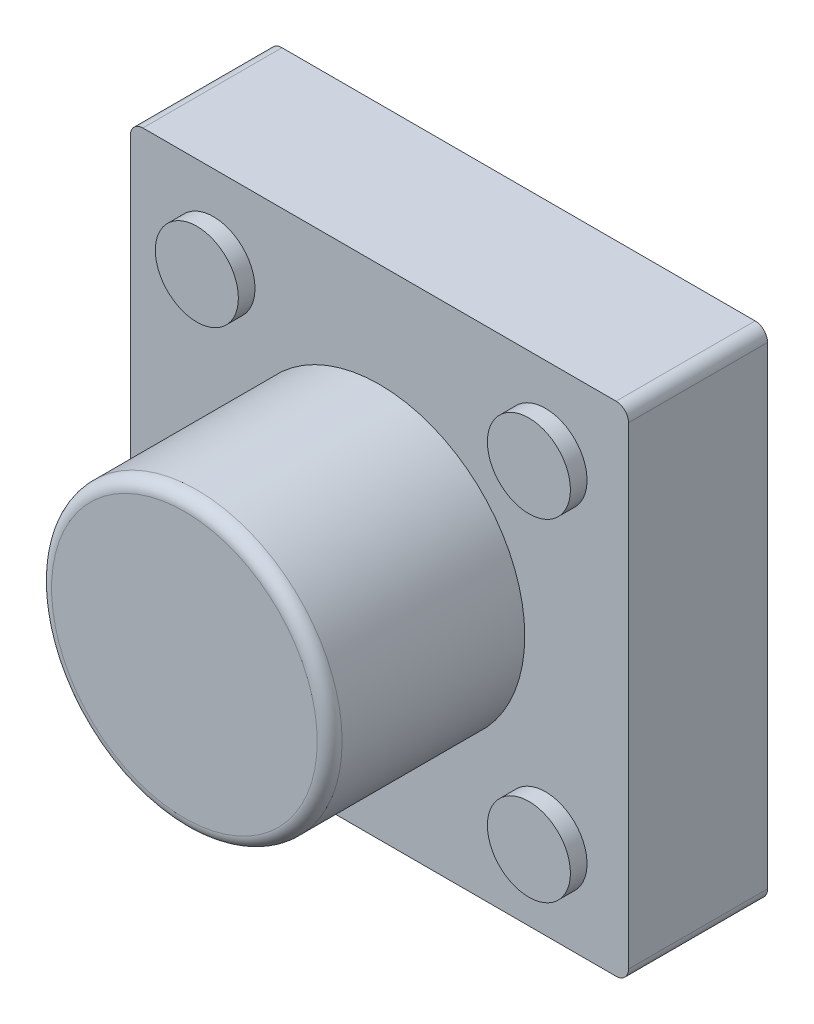
ISO-10303-21;
HEADER;
FILE_DESCRIPTION(('STEP AP214'),'2;1');
FILE_NAME('part.step','',(''),(''),'','','');
FILE_SCHEMA(('AUTOMOTIVE_DESIGN { 1 0 10303 214 1 1 1 1 }'));
ENDSEC;
DATA;
#1=APPLICATION_CONTEXT('core data for automotive mechanical design processes');
#2=APPLICATION_PROTOCOL_DEFINITION('international standard','automotive_design',2000,#1);
#3=PRODUCT_CONTEXT('',#1,'mechanical');
#4=PRODUCT('Part','Part','',(#3));
#5=PRODUCT_RELATED_PRODUCT_CATEGORY('part','',(#4));
#6=PRODUCT_DEFINITION_FORMATION('','',#4);
#7=PRODUCT_DEFINITION_CONTEXT('part definition',#1,'design');
#8=PRODUCT_DEFINITION('design','',#6,#7);
#9=PRODUCT_DEFINITION_SHAPE('','',#8);
#10=(LENGTH_UNIT() NAMED_UNIT(*) SI_UNIT(.MILLI.,.METRE.));
#11=(NAMED_UNIT(*) PLANE_ANGLE_UNIT() SI_UNIT($,.RADIAN.));
#12=(NAMED_UNIT(*) SI_UNIT($,.STERADIAN.) SOLID_ANGLE_UNIT());
#13=UNCERTAINTY_MEASURE_WITH_UNIT(LENGTH_MEASURE(1.E-05),#10,'distance_accuracy_value','');
#14=(GEOMETRIC_REPRESENTATION_CONTEXT(3) GLOBAL_UNCERTAINTY_ASSIGNED_CONTEXT((#13)) GLOBAL_UNIT_ASSIGNED_CONTEXT((#10,
#11,#12)) REPRESENTATION_CONTEXT('',''));
#15=CARTESIAN_POINT('',(0.,0.,0.));
#16=DIRECTION('',(0.,0.,1.));
#17=DIRECTION('',(1.,0.,0.));
#18=AXIS2_PLACEMENT_3D('',#15,#16,#17);
#19=CARTESIAN_POINT('',(0.,0.,3.35));
#20=DIRECTION('',(0.,0.,-1.));
#21=DIRECTION('',(-1.,0.,0.));
#22=AXIS2_PLACEMENT_3D('',#19,#20,#21);
#23=PLANE('',#22);
#24=DIRECTION('',(0.,-1.,0.));
#25=VECTOR('',#24,1.);
#26=CARTESIAN_POINT('',(0.,0.,3.35));
#27=LINE('',#26,#25);
#28=CARTESIAN_POINT('',(0.,11.7,3.35));
#29=VERTEX_POINT('',#28);
#30=CARTESIAN_POINT('',(0.,0.3,3.35));
#31=VERTEX_POINT('',#30);
#32=EDGE_CURVE('E139',#29,#31,#27,.T.);
#33=ORIENTED_EDGE('',*,*,#32,.T.);
#34=CARTESIAN_POINT('',(0.3,0.3,3.35));
#35=DIRECTION('',(0.,0.,-1.));
#36=DIRECTION('',(-1.,0.,0.));
#37=AXIS2_PLACEMENT_3D('',#34,#35,#36);
#38=CIRCLE('',#37,0.3);
#39=CARTESIAN_POINT('',(0.3,0.,3.35));
#40=VERTEX_POINT('',#39);
#41=EDGE_CURVE('E163',#31,#40,#38,.F.);
#42=ORIENTED_EDGE('',*,*,#41,.T.);
#43=DIRECTION('',(1.,0.,0.));
#44=VECTOR('',#43,1.);
#45=CARTESIAN_POINT('',(0.,0.,3.35));
#46=LINE('',#45,#44);
#47=CARTESIAN_POINT('',(11.7,0.,3.35));
#48=VERTEX_POINT('',#47);
#49=EDGE_CURVE('E122',#40,#48,#46,.T.);
#50=ORIENTED_EDGE('',*,*,#49,.T.);
#51=CARTESIAN_POINT('',(11.7,0.3,3.35));
#52=DIRECTION('',(0.,0.,-1.));
#53=DIRECTION('',(-1.,0.,0.));
#54=AXIS2_PLACEMENT_3D('',#51,#52,#53);
#55=CIRCLE('',#54,0.3);
#56=CARTESIAN_POINT('',(12.,0.3,3.35));
#57=VERTEX_POINT('',#56);
#58=EDGE_CURVE('E158',#48,#57,#55,.F.);
#59=ORIENTED_EDGE('',*,*,#58,.T.);
#60=DIRECTION('',(0.,1.,0.));
#61=VECTOR('',#60,1.);
#62=CARTESIAN_POINT('',(12.,0.,3.35));
#63=LINE('',#62,#61);
#64=CARTESIAN_POINT('',(12.,11.7,3.35));
#65=VERTEX_POINT('',#64);
#66=EDGE_CURVE('E271',#57,#65,#63,.T.);
#67=ORIENTED_EDGE('',*,*,#66,.T.);
#68=CARTESIAN_POINT('',(11.7,11.7,3.35));
#69=DIRECTION('',(0.,0.,-1.));
#70=DIRECTION('',(-1.,0.,0.));
#71=AXIS2_PLACEMENT_3D('',#68,#69,#70);
#72=CIRCLE('',#71,0.3);
#73=CARTESIAN_POINT('',(11.7,12.,3.35));
#74=VERTEX_POINT('',#73);
#75=EDGE_CURVE('E57',#65,#74,#72,.F.);
#76=ORIENTED_EDGE('',*,*,#75,.T.);
#77=DIRECTION('',(-1.,0.,0.));
#78=VECTOR('',#77,1.);
#79=CARTESIAN_POINT('',(0.,12.,3.35));
#80=LINE('',#79,#78);
#81=CARTESIAN_POINT('',(0.3,12.,3.35));
#82=VERTEX_POINT('',#81);
#83=EDGE_CURVE('E144',#74,#82,#80,.T.);
#84=ORIENTED_EDGE('',*,*,#83,.T.);
#85=CARTESIAN_POINT('',(0.3,11.7,3.35));
#86=DIRECTION('',(0.,0.,-1.));
#87=DIRECTION('',(-1.,0.,0.));
#88=AXIS2_PLACEMENT_3D('',#85,#86,#87);
#89=CIRCLE('',#88,0.3);
#90=EDGE_CURVE('E161',#82,#29,#89,.F.);
#91=ORIENTED_EDGE('',*,*,#90,.T.);
#92=EDGE_LOOP('',(#33,#42,#50,#59,#67,#76,#84,#91));
#93=FACE_BOUND('',#92,.T.);
#94=CARTESIAN_POINT('',(6.,6.,3.35));
#95=DIRECTION('',(0.,0.,-1.));
#96=DIRECTION('',(-1.,0.,0.));
#97=AXIS2_PLACEMENT_3D('',#94,#95,#96);
#98=CIRCLE('',#97,3.5);
#99=CARTESIAN_POINT('',(2.5,6.,3.35));
#100=VERTEX_POINT('',#99);
#101=EDGE_CURVE('E140',#100,#100,#98,.F.);
#102=ORIENTED_EDGE('',*,*,#101,.F.);
#103=EDGE_LOOP('',(#102));
#104=FACE_BOUND('',#103,.T.);
#105=CARTESIAN_POINT('',(2.,10.,3.35));
#106=DIRECTION('',(0.,0.,-1.));
#107=DIRECTION('',(-1.,0.,0.));
#108=AXIS2_PLACEMENT_3D('',#105,#106,#107);
#109=CIRCLE('',#108,1.);
#110=CARTESIAN_POINT('',(0.999999999999999,10.,3.35));
#111=VERTEX_POINT('',#110);
#112=EDGE_CURVE('E174',#111,#111,#109,.F.);
#113=ORIENTED_EDGE('',*,*,#112,.F.);
#114=EDGE_LOOP('',(#113));
#115=FACE_BOUND('',#114,.T.);
#116=CARTESIAN_POINT('',(10.,10.,3.35));
#117=DIRECTION('',(0.,0.,-1.));
#118=DIRECTION('',(-1.,0.,0.));
#119=AXIS2_PLACEMENT_3D('',#116,#117,#118);
#120=CIRCLE('',#119,1.);
#121=CARTESIAN_POINT('',(9.,10.,3.35));
#122=VERTEX_POINT('',#121);
#123=EDGE_CURVE('E177',#122,#122,#120,.F.);
#124=ORIENTED_EDGE('',*,*,#123,.F.);
#125=EDGE_LOOP('',(#124));
#126=FACE_BOUND('',#125,.T.);
#127=CARTESIAN_POINT('',(10.,2.,3.35));
#128=DIRECTION('',(0.,0.,-1.));
#129=DIRECTION('',(-1.,0.,0.));
#130=AXIS2_PLACEMENT_3D('',#127,#128,#129);
#131=CIRCLE('',#130,1.);
#132=CARTESIAN_POINT('',(9.,2.,3.35));
#133=VERTEX_POINT('',#132);
#134=EDGE_CURVE('E43',#133,#133,#131,.F.);
#135=ORIENTED_EDGE('',*,*,#134,.F.);
#136=EDGE_LOOP('',(#135));
#137=FACE_BOUND('',#136,.T.);
#138=CARTESIAN_POINT('',(2.,2.,3.35));
#139=DIRECTION('',(0.,0.,-1.));
#140=DIRECTION('',(-1.,0.,0.));
#141=AXIS2_PLACEMENT_3D('',#138,#139,#140);
#142=CIRCLE('',#141,1.);
#143=CARTESIAN_POINT('',(1.,2.,3.35));
#144=VERTEX_POINT('',#143);
#145=EDGE_CURVE('E11',#144,#144,#142,.F.);
#146=ORIENTED_EDGE('',*,*,#145,.F.);
#147=EDGE_LOOP('',(#146));
#148=FACE_BOUND('',#147,.T.);
#149=ADVANCED_FACE('F35',(#93,#104,#115,#126,#137,#148),#23,.F.);
#150=CARTESIAN_POINT('',(0.,0.,3.35));
#151=DIRECTION('',(1.,0.,0.));
#152=DIRECTION('',(0.,0.,-1.));
#153=AXIS2_PLACEMENT_3D('',#150,#151,#152);
#154=PLANE('',#153);
#155=DIRECTION('',(0.,-1.,0.));
#156=VECTOR('',#155,1.);
#157=CARTESIAN_POINT('',(0.,0.,0.));
#158=LINE('',#157,#156);
#159=CARTESIAN_POINT('',(0.,11.7,0.));
#160=VERTEX_POINT('',#159);
#161=CARTESIAN_POINT('',(0.,0.3,0.));
#162=VERTEX_POINT('',#161);
#163=EDGE_CURVE('E129',#160,#162,#158,.T.);
#164=ORIENTED_EDGE('',*,*,#163,.T.);
#165=DIRECTION('',(0.,0.,-1.));
#166=VECTOR('',#165,1.);
#167=CARTESIAN_POINT('',(0.,0.3,3.35));
#168=LINE('',#167,#166);
#169=EDGE_CURVE('E107',#162,#31,#168,.F.);
#170=ORIENTED_EDGE('',*,*,#169,.T.);
#171=ORIENTED_EDGE('',*,*,#32,.F.);
#172=DIRECTION('',(0.,0.,-1.));
#173=VECTOR('',#172,1.);
#174=CARTESIAN_POINT('',(0.,11.7,3.35));
#175=LINE('',#174,#173);
#176=EDGE_CURVE('E112',#29,#160,#175,.T.);
#177=ORIENTED_EDGE('',*,*,#176,.T.);
#178=EDGE_LOOP('',(#164,#170,#171,#177));
#179=FACE_BOUND('',#178,.T.);
#180=ADVANCED_FACE('F186',(#179),#154,.F.);
#181=CARTESIAN_POINT('',(0.,0.,3.35));
#182=DIRECTION('',(0.,1.,0.));
#183=DIRECTION('',(0.,0.,1.));
#184=AXIS2_PLACEMENT_3D('',#181,#182,#183);
#185=PLANE('',#184);
#186=ORIENTED_EDGE('',*,*,#49,.F.);
#187=DIRECTION('',(0.,0.,-1.));
#188=VECTOR('',#187,1.);
#189=CARTESIAN_POINT('',(0.3,0.,3.35));
#190=LINE('',#189,#188);
#191=CARTESIAN_POINT('',(0.3,0.,0.));
#192=VERTEX_POINT('',#191);
#193=EDGE_CURVE('E106',#40,#192,#190,.T.);
#194=ORIENTED_EDGE('',*,*,#193,.T.);
#195=DIRECTION('',(1.,0.,0.));
#196=VECTOR('',#195,1.);
#197=CARTESIAN_POINT('',(0.,0.,0.));
#198=LINE('',#197,#196);
#199=CARTESIAN_POINT('',(11.7,0.,0.));
#200=VERTEX_POINT('',#199);
#201=EDGE_CURVE('E119',#192,#200,#198,.T.);
#202=ORIENTED_EDGE('',*,*,#201,.T.);
#203=DIRECTION('',(0.,0.,-1.));
#204=VECTOR('',#203,1.);
#205=CARTESIAN_POINT('',(11.7,0.,3.35));
#206=LINE('',#205,#204);
#207=EDGE_CURVE('E124',#200,#48,#206,.F.);
#208=ORIENTED_EDGE('',*,*,#207,.T.);
#209=EDGE_LOOP('',(#186,#194,#202,#208));
#210=FACE_BOUND('',#209,.T.);
#211=ADVANCED_FACE('F118',(#210),#185,.F.);
#212=CARTESIAN_POINT('',(12.,0.,3.35));
#213=DIRECTION('',(-1.,0.,0.));
#214=DIRECTION('',(0.,0.,1.));
#215=AXIS2_PLACEMENT_3D('',#212,#213,#214);
#216=PLANE('',#215);
#217=DIRECTION('',(0.,1.,0.));
#218=VECTOR('',#217,1.);
#219=CARTESIAN_POINT('',(12.,0.,0.));
#220=LINE('',#219,#218);
#221=CARTESIAN_POINT('',(12.,0.3,0.));
#222=VERTEX_POINT('',#221);
#223=CARTESIAN_POINT('',(12.,11.7,0.));
#224=VERTEX_POINT('',#223);
#225=EDGE_CURVE('E128',#222,#224,#220,.T.);
#226=ORIENTED_EDGE('',*,*,#225,.T.);
#227=DIRECTION('',(0.,0.,-1.));
#228=VECTOR('',#227,1.);
#229=CARTESIAN_POINT('',(12.,11.7,3.35));
#230=LINE('',#229,#228);
#231=EDGE_CURVE('E172',#224,#65,#230,.F.);
#232=ORIENTED_EDGE('',*,*,#231,.T.);
#233=ORIENTED_EDGE('',*,*,#66,.F.);
#234=DIRECTION('',(0.,0.,-1.));
#235=VECTOR('',#234,1.);
#236=CARTESIAN_POINT('',(12.,0.3,3.35));
#237=LINE('',#236,#235);
#238=EDGE_CURVE('E169',#57,#222,#237,.T.);
#239=ORIENTED_EDGE('',*,*,#238,.T.);
#240=EDGE_LOOP('',(#226,#232,#233,#239));
#241=FACE_BOUND('',#240,.T.);
#242=ADVANCED_FACE('F239',(#241),#216,.F.);
#243=CARTESIAN_POINT('',(0.,12.,3.35));
#244=DIRECTION('',(0.,-1.,0.));
#245=DIRECTION('',(0.,0.,-1.));
#246=AXIS2_PLACEMENT_3D('',#243,#244,#245);
#247=PLANE('',#246);
#248=DIRECTION('',(-1.,0.,0.));
#249=VECTOR('',#248,1.);
#250=CARTESIAN_POINT('',(0.,12.,0.));
#251=LINE('',#250,#249);
#252=CARTESIAN_POINT('',(11.7,12.,0.));
#253=VERTEX_POINT('',#252);
#254=CARTESIAN_POINT('',(0.3,12.,0.));
#255=VERTEX_POINT('',#254);
#256=EDGE_CURVE('E132',#253,#255,#251,.T.);
#257=ORIENTED_EDGE('',*,*,#256,.T.);
#258=DIRECTION('',(0.,0.,-1.));
#259=VECTOR('',#258,1.);
#260=CARTESIAN_POINT('',(0.3,12.,3.35));
#261=LINE('',#260,#259);
#262=EDGE_CURVE('E50',#255,#82,#261,.F.);
#263=ORIENTED_EDGE('',*,*,#262,.T.);
#264=ORIENTED_EDGE('',*,*,#83,.F.);
#265=DIRECTION('',(0.,0.,-1.));
#266=VECTOR('',#265,1.);
#267=CARTESIAN_POINT('',(11.7,12.,3.35));
#268=LINE('',#267,#266);
#269=EDGE_CURVE('E165',#74,#253,#268,.T.);
#270=ORIENTED_EDGE('',*,*,#269,.T.);
#271=EDGE_LOOP('',(#257,#263,#264,#270));
#272=FACE_BOUND('',#271,.T.);
#273=ADVANCED_FACE('F236',(#272),#247,.F.);
#274=CARTESIAN_POINT('',(0.,0.,0.));
#275=DIRECTION('',(0.,0.,-1.));
#276=DIRECTION('',(-1.,0.,0.));
#277=AXIS2_PLACEMENT_3D('',#274,#275,#276);
#278=PLANE('',#277);
#279=ORIENTED_EDGE('',*,*,#201,.F.);
#280=CARTESIAN_POINT('',(0.3,0.3,0.));
#281=DIRECTION('',(0.,0.,-1.));
#282=DIRECTION('',(-1.,0.,0.));
#283=AXIS2_PLACEMENT_3D('',#280,#281,#282);
#284=CIRCLE('',#283,0.3);
#285=EDGE_CURVE('E102',#192,#162,#284,.T.);
#286=ORIENTED_EDGE('',*,*,#285,.T.);
#287=ORIENTED_EDGE('',*,*,#163,.F.);
#288=CARTESIAN_POINT('',(0.3,11.7,0.));
#289=DIRECTION('',(0.,0.,-1.));
#290=DIRECTION('',(-1.,0.,0.));
#291=AXIS2_PLACEMENT_3D('',#288,#289,#290);
#292=CIRCLE('',#291,0.3);
#293=EDGE_CURVE('E113',#160,#255,#292,.T.);
#294=ORIENTED_EDGE('',*,*,#293,.T.);
#295=ORIENTED_EDGE('',*,*,#256,.F.);
#296=CARTESIAN_POINT('',(11.7,11.7,0.));
#297=DIRECTION('',(0.,0.,-1.));
#298=DIRECTION('',(-1.,0.,0.));
#299=AXIS2_PLACEMENT_3D('',#296,#297,#298);
#300=CIRCLE('',#299,0.3);
#301=EDGE_CURVE('E152',#253,#224,#300,.T.);
#302=ORIENTED_EDGE('',*,*,#301,.T.);
#303=ORIENTED_EDGE('',*,*,#225,.F.);
#304=CARTESIAN_POINT('',(11.7,0.3,0.));
#305=DIRECTION('',(0.,0.,-1.));
#306=DIRECTION('',(-1.,0.,0.));
#307=AXIS2_PLACEMENT_3D('',#304,#305,#306);
#308=CIRCLE('',#307,0.3);
#309=EDGE_CURVE('E123',#222,#200,#308,.T.);
#310=ORIENTED_EDGE('',*,*,#309,.T.);
#311=EDGE_LOOP('',(#279,#286,#287,#294,#295,#302,#303,#310));
#312=FACE_BOUND('',#311,.T.);
#313=ADVANCED_FACE('F126',(#312),#278,.T.);
#314=CARTESIAN_POINT('',(6.,6.,8.05));
#315=DIRECTION('',(0.,0.,-1.));
#316=DIRECTION('',(-1.,0.,0.));
#317=AXIS2_PLACEMENT_3D('',#314,#315,#316);
#318=CYLINDRICAL_SURFACE('',#317,3.5);
#319=CARTESIAN_POINT('',(6.,6.,7.75));
#320=DIRECTION('',(0.,0.,1.));
#321=DIRECTION('',(1.,0.,0.));
#322=AXIS2_PLACEMENT_3D('',#319,#320,#321);
#323=CIRCLE('',#322,3.5);
#324=CARTESIAN_POINT('',(9.5,6.,7.75));
#325=VERTEX_POINT('',#324);
#326=EDGE_CURVE('E147',#325,#325,#323,.F.);
#327=ORIENTED_EDGE('',*,*,#326,.T.);
#328=EDGE_LOOP('',(#327));
#329=FACE_BOUND('',#328,.T.);
#330=ORIENTED_EDGE('',*,*,#101,.T.);
#331=EDGE_LOOP('',(#330));
#332=FACE_BOUND('',#331,.T.);
#333=ADVANCED_FACE('F229',(#329,#332),#318,.T.);
#334=CARTESIAN_POINT('',(6.,6.,8.05));
#335=DIRECTION('',(0.,0.,1.));
#336=DIRECTION('',(1.,0.,0.));
#337=AXIS2_PLACEMENT_3D('',#334,#335,#336);
#338=PLANE('',#337);
#339=CARTESIAN_POINT('',(6.,6.,8.05));
#340=DIRECTION('',(0.,0.,1.));
#341=DIRECTION('',(1.,0.,0.));
#342=AXIS2_PLACEMENT_3D('',#339,#340,#341);
#343=CIRCLE('',#342,3.2);
#344=CARTESIAN_POINT('',(9.2,6.,8.05));
#345=VERTEX_POINT('',#344);
#346=EDGE_CURVE('E143',#345,#345,#343,.T.);
#347=ORIENTED_EDGE('',*,*,#346,.T.);
#348=EDGE_LOOP('',(#347));
#349=FACE_BOUND('',#348,.T.);
#350=ADVANCED_FACE('F225',(#349),#338,.T.);
#351=CARTESIAN_POINT('',(6.,6.,7.75));
#352=DIRECTION('',(0.,0.,1.));
#353=DIRECTION('',(1.,0.,0.));
#354=AXIS2_PLACEMENT_3D('',#351,#352,#353);
#355=TOROIDAL_SURFACE('',#354,3.2,0.3);
#356=ORIENTED_EDGE('',*,*,#326,.F.);
#357=EDGE_LOOP('',(#356));
#358=FACE_BOUND('',#357,.T.);
#359=ORIENTED_EDGE('',*,*,#346,.F.);
#360=EDGE_LOOP('',(#359));
#361=FACE_BOUND('',#360,.T.);
#362=ADVANCED_FACE('F228',(#358,#361),#355,.T.);
#363=CARTESIAN_POINT('',(0.3,0.3,3.35));
#364=DIRECTION('',(0.,0.,-1.));
#365=DIRECTION('',(-1.,0.,0.));
#366=AXIS2_PLACEMENT_3D('',#363,#364,#365);
#367=CYLINDRICAL_SURFACE('',#366,0.3);
#368=ORIENTED_EDGE('',*,*,#41,.F.);
#369=ORIENTED_EDGE('',*,*,#169,.F.);
#370=ORIENTED_EDGE('',*,*,#285,.F.);
#371=ORIENTED_EDGE('',*,*,#193,.F.);
#372=EDGE_LOOP('',(#368,#369,#370,#371));
#373=FACE_BOUND('',#372,.T.);
#374=ADVANCED_FACE('F105',(#373),#367,.T.);
#375=CARTESIAN_POINT('',(0.3,11.7,3.35));
#376=DIRECTION('',(0.,0.,-1.));
#377=DIRECTION('',(-1.,0.,0.));
#378=AXIS2_PLACEMENT_3D('',#375,#376,#377);
#379=CYLINDRICAL_SURFACE('',#378,0.3);
#380=ORIENTED_EDGE('',*,*,#90,.F.);
#381=ORIENTED_EDGE('',*,*,#262,.F.);
#382=ORIENTED_EDGE('',*,*,#293,.F.);
#383=ORIENTED_EDGE('',*,*,#176,.F.);
#384=EDGE_LOOP('',(#380,#381,#382,#383));
#385=FACE_BOUND('',#384,.T.);
#386=ADVANCED_FACE('F253',(#385),#379,.T.);
#387=CARTESIAN_POINT('',(11.7,11.7,3.35));
#388=DIRECTION('',(0.,0.,-1.));
#389=DIRECTION('',(-1.,0.,0.));
#390=AXIS2_PLACEMENT_3D('',#387,#388,#389);
#391=CYLINDRICAL_SURFACE('',#390,0.3);
#392=ORIENTED_EDGE('',*,*,#75,.F.);
#393=ORIENTED_EDGE('',*,*,#231,.F.);
#394=ORIENTED_EDGE('',*,*,#301,.F.);
#395=ORIENTED_EDGE('',*,*,#269,.F.);
#396=EDGE_LOOP('',(#392,#393,#394,#395));
#397=FACE_BOUND('',#396,.T.);
#398=ADVANCED_FACE('F255',(#397),#391,.T.);
#399=CARTESIAN_POINT('',(11.7,0.3,3.35));
#400=DIRECTION('',(0.,0.,-1.));
#401=DIRECTION('',(-1.,0.,0.));
#402=AXIS2_PLACEMENT_3D('',#399,#400,#401);
#403=CYLINDRICAL_SURFACE('',#402,0.3);
#404=ORIENTED_EDGE('',*,*,#58,.F.);
#405=ORIENTED_EDGE('',*,*,#207,.F.);
#406=ORIENTED_EDGE('',*,*,#309,.F.);
#407=ORIENTED_EDGE('',*,*,#238,.F.);
#408=EDGE_LOOP('',(#404,#405,#406,#407));
#409=FACE_BOUND('',#408,.T.);
#410=ADVANCED_FACE('F37',(#409),#403,.T.);
#411=CARTESIAN_POINT('',(2.,10.,3.75));
#412=DIRECTION('',(0.,0.,-1.));
#413=DIRECTION('',(-1.,0.,0.));
#414=AXIS2_PLACEMENT_3D('',#411,#412,#413);
#415=CYLINDRICAL_SURFACE('',#414,1.);
#416=CARTESIAN_POINT('',(2.,10.,3.75));
#417=DIRECTION('',(0.,0.,1.));
#418=DIRECTION('',(1.,0.,0.));
#419=AXIS2_PLACEMENT_3D('',#416,#417,#418);
#420=CIRCLE('',#419,1.);
#421=CARTESIAN_POINT('',(3.,10.,3.75));
#422=VERTEX_POINT('',#421);
#423=EDGE_CURVE('E134',#422,#422,#420,.T.);
#424=ORIENTED_EDGE('',*,*,#423,.F.);
#425=EDGE_LOOP('',(#424));
#426=FACE_BOUND('',#425,.T.);
#427=ORIENTED_EDGE('',*,*,#112,.T.);
#428=EDGE_LOOP('',(#427));
#429=FACE_BOUND('',#428,.T.);
#430=ADVANCED_FACE('F220',(#426,#429),#415,.T.);
#431=CARTESIAN_POINT('',(2.,10.,3.75));
#432=DIRECTION('',(0.,0.,1.));
#433=DIRECTION('',(1.,0.,0.));
#434=AXIS2_PLACEMENT_3D('',#431,#432,#433);
#435=PLANE('',#434);
#436=ORIENTED_EDGE('',*,*,#423,.T.);
#437=EDGE_LOOP('',(#436));
#438=FACE_BOUND('',#437,.T.);
#439=ADVANCED_FACE('F216',(#438),#435,.T.);
#440=CARTESIAN_POINT('',(10.,10.,3.75));
#441=DIRECTION('',(0.,0.,-1.));
#442=DIRECTION('',(-1.,0.,0.));
#443=AXIS2_PLACEMENT_3D('',#440,#441,#442);
#444=CYLINDRICAL_SURFACE('',#443,1.);
#445=CARTESIAN_POINT('',(10.,10.,3.75));
#446=DIRECTION('',(0.,0.,1.));
#447=DIRECTION('',(1.,0.,0.));
#448=AXIS2_PLACEMENT_3D('',#445,#446,#447);
#449=CIRCLE('',#448,1.);
#450=CARTESIAN_POINT('',(11.,10.,3.75));
#451=VERTEX_POINT('',#450);
#452=EDGE_CURVE('E289',#451,#451,#449,.T.);
#453=ORIENTED_EDGE('',*,*,#452,.F.);
#454=EDGE_LOOP('',(#453));
#455=FACE_BOUND('',#454,.T.);
#456=ORIENTED_EDGE('',*,*,#123,.T.);
#457=EDGE_LOOP('',(#456));
#458=FACE_BOUND('',#457,.T.);
#459=ADVANCED_FACE('F212',(#455,#458),#444,.T.);
#460=CARTESIAN_POINT('',(10.,10.,3.75));
#461=DIRECTION('',(0.,0.,1.));
#462=DIRECTION('',(1.,0.,0.));
#463=AXIS2_PLACEMENT_3D('',#460,#461,#462);
#464=PLANE('',#463);
#465=ORIENTED_EDGE('',*,*,#452,.T.);
#466=EDGE_LOOP('',(#465));
#467=FACE_BOUND('',#466,.T.);
#468=ADVANCED_FACE('F208',(#467),#464,.T.);
#469=CARTESIAN_POINT('',(10.,2.,3.75));
#470=DIRECTION('',(0.,0.,-1.));
#471=DIRECTION('',(-1.,0.,0.));
#472=AXIS2_PLACEMENT_3D('',#469,#470,#471);
#473=CYLINDRICAL_SURFACE('',#472,1.);
#474=CARTESIAN_POINT('',(10.,2.,3.75));
#475=DIRECTION('',(0.,0.,1.));
#476=DIRECTION('',(1.,0.,0.));
#477=AXIS2_PLACEMENT_3D('',#474,#475,#476);
#478=CIRCLE('',#477,1.);
#479=CARTESIAN_POINT('',(11.,2.,3.75));
#480=VERTEX_POINT('',#479);
#481=EDGE_CURVE('E292',#480,#480,#478,.T.);
#482=ORIENTED_EDGE('',*,*,#481,.F.);
#483=EDGE_LOOP('',(#482));
#484=FACE_BOUND('',#483,.T.);
#485=ORIENTED_EDGE('',*,*,#134,.T.);
#486=EDGE_LOOP('',(#485));
#487=FACE_BOUND('',#486,.T.);
#488=ADVANCED_FACE('F182',(#484,#487),#473,.T.);
#489=CARTESIAN_POINT('',(10.,2.,3.75));
#490=DIRECTION('',(0.,0.,1.));
#491=DIRECTION('',(1.,0.,0.));
#492=AXIS2_PLACEMENT_3D('',#489,#490,#491);
#493=PLANE('',#492);
#494=ORIENTED_EDGE('',*,*,#481,.T.);
#495=EDGE_LOOP('',(#494));
#496=FACE_BOUND('',#495,.T.);
#497=ADVANCED_FACE('F193',(#496),#493,.T.);
#498=CARTESIAN_POINT('',(2.,2.,3.75));
#499=DIRECTION('',(0.,0.,-1.));
#500=DIRECTION('',(-1.,0.,0.));
#501=AXIS2_PLACEMENT_3D('',#498,#499,#500);
#502=CYLINDRICAL_SURFACE('',#501,1.);
#503=CARTESIAN_POINT('',(2.,2.,3.75));
#504=DIRECTION('',(0.,0.,1.));
#505=DIRECTION('',(1.,0.,0.));
#506=AXIS2_PLACEMENT_3D('',#503,#504,#505);
#507=CIRCLE('',#506,1.);
#508=CARTESIAN_POINT('',(3.,2.,3.75));
#509=VERTEX_POINT('',#508);
#510=EDGE_CURVE('E295',#509,#509,#507,.T.);
#511=ORIENTED_EDGE('',*,*,#510,.F.);
#512=EDGE_LOOP('',(#511));
#513=FACE_BOUND('',#512,.T.);
#514=ORIENTED_EDGE('',*,*,#145,.T.);
#515=EDGE_LOOP('',(#514));
#516=FACE_BOUND('',#515,.T.);
#517=ADVANCED_FACE('F190',(#513,#516),#502,.T.);
#518=CARTESIAN_POINT('',(2.,2.,3.75));
#519=DIRECTION('',(0.,0.,1.));
#520=DIRECTION('',(1.,0.,0.));
#521=AXIS2_PLACEMENT_3D('',#518,#519,#520);
#522=PLANE('',#521);
#523=ORIENTED_EDGE('',*,*,#510,.T.);
#524=EDGE_LOOP('',(#523));
#525=FACE_BOUND('',#524,.T.);
#526=ADVANCED_FACE('F192',(#525),#522,.T.);
#527=CLOSED_SHELL('',(#149,#180,#211,#242,#273,#313,#333,#350,#362,#374,#386,#398,#410,#430,
#439,#459,#468,#488,#497,#517,#526));
#528=MANIFOLD_SOLID_BREP('B2',#527);
#529=ADVANCED_BREP_SHAPE_REPRESENTATION('',(#18,#528),#14);
#530=SHAPE_DEFINITION_REPRESENTATION(#9,#529);
ENDSEC;
END-ISO-10303-21;
